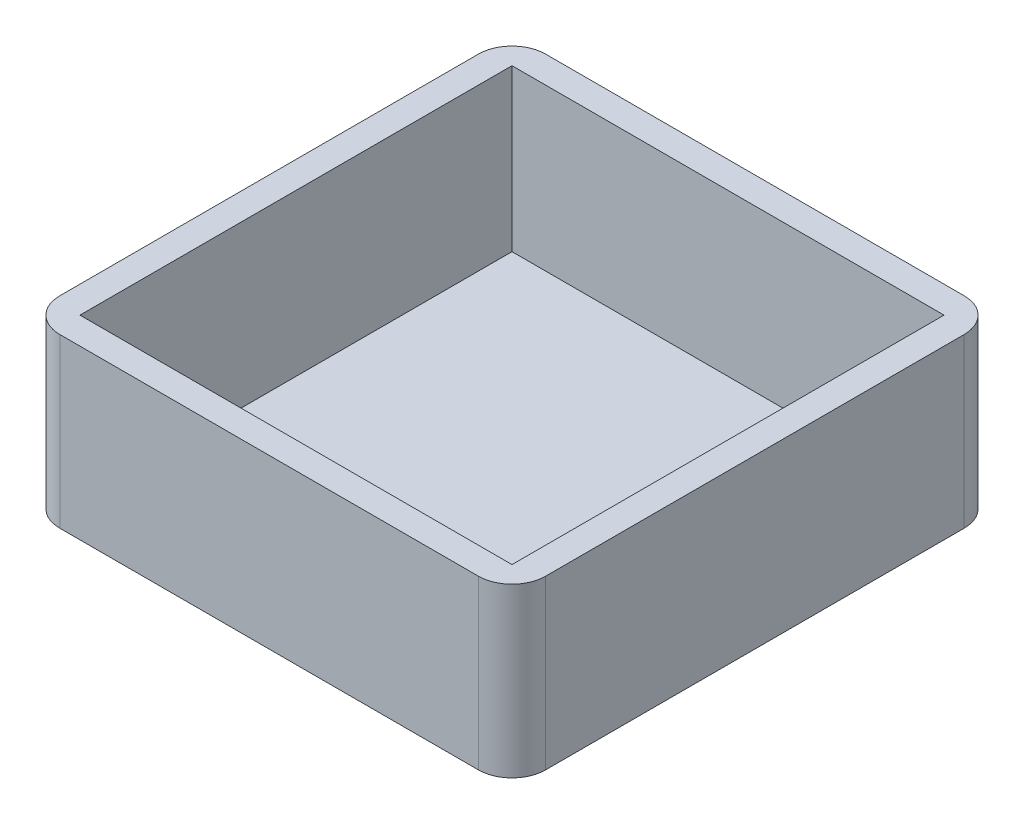
ISO-10303-21;
HEADER;
FILE_DESCRIPTION(('STEP AP214'),'2;1');
FILE_NAME('part.step','',(''),(''),'','','');
FILE_SCHEMA(('AUTOMOTIVE_DESIGN { 1 0 10303 214 1 1 1 1 }'));
ENDSEC;
DATA;
#1=APPLICATION_CONTEXT('core data for automotive mechanical design processes');
#2=APPLICATION_PROTOCOL_DEFINITION('international standard','automotive_design',2000,#1);
#3=PRODUCT_CONTEXT('',#1,'mechanical');
#4=PRODUCT('Part','Part','',(#3));
#5=PRODUCT_RELATED_PRODUCT_CATEGORY('part','',(#4));
#6=PRODUCT_DEFINITION_FORMATION('','',#4);
#7=PRODUCT_DEFINITION_CONTEXT('part definition',#1,'design');
#8=PRODUCT_DEFINITION('design','',#6,#7);
#9=PRODUCT_DEFINITION_SHAPE('','',#8);
#10=(LENGTH_UNIT() NAMED_UNIT(*) SI_UNIT(.MILLI.,.METRE.));
#11=(NAMED_UNIT(*) PLANE_ANGLE_UNIT() SI_UNIT($,.RADIAN.));
#12=(NAMED_UNIT(*) SI_UNIT($,.STERADIAN.) SOLID_ANGLE_UNIT());
#13=UNCERTAINTY_MEASURE_WITH_UNIT(LENGTH_MEASURE(1.E-05),#10,'distance_accuracy_value','');
#14=(GEOMETRIC_REPRESENTATION_CONTEXT(3) GLOBAL_UNCERTAINTY_ASSIGNED_CONTEXT((#13)) GLOBAL_UNIT_ASSIGNED_CONTEXT((#10,
#11,#12)) REPRESENTATION_CONTEXT('',''));
#15=CARTESIAN_POINT('',(0.,0.,0.));
#16=DIRECTION('',(0.,0.,1.));
#17=DIRECTION('',(1.,0.,0.));
#18=AXIS2_PLACEMENT_3D('',#15,#16,#17);
#19=CARTESIAN_POINT('',(72.3760070733407,50.,72.3760070733407));
#20=DIRECTION('',(-1.,0.,0.));
#21=DIRECTION('',(0.,0.,1.));
#22=AXIS2_PLACEMENT_3D('',#19,#20,#21);
#23=PLANE('',#22);
#24=DIRECTION('',(0.,0.,-1.));
#25=VECTOR('',#24,1.);
#26=CARTESIAN_POINT('',(72.3760070733407,0.,72.3760070733407));
#27=LINE('',#26,#25);
#28=CARTESIAN_POINT('',(72.3760070733407,0.,62.3760070733407));
#29=VERTEX_POINT('',#28);
#30=CARTESIAN_POINT('',(72.3760070733407,0.,-62.3760070733407));
#31=VERTEX_POINT('',#30);
#32=EDGE_CURVE('E167',#29,#31,#27,.T.);
#33=ORIENTED_EDGE('',*,*,#32,.T.);
#34=DIRECTION('',(0.,-1.,0.));
#35=VECTOR('',#34,1.);
#36=CARTESIAN_POINT('',(72.3760070733407,50.,-62.3760070733407));
#37=LINE('',#36,#35);
#38=CARTESIAN_POINT('',(72.3760070733407,50.,-62.3760070733407));
#39=VERTEX_POINT('',#38);
#40=EDGE_CURVE('E216',#31,#39,#37,.F.);
#41=ORIENTED_EDGE('',*,*,#40,.T.);
#42=DIRECTION('',(0.,0.,-1.));
#43=VECTOR('',#42,1.);
#44=CARTESIAN_POINT('',(72.3760070733407,50.,72.3760070733407));
#45=LINE('',#44,#43);
#46=CARTESIAN_POINT('',(72.3760070733407,50.,62.3760070733407));
#47=VERTEX_POINT('',#46);
#48=EDGE_CURVE('E168',#47,#39,#45,.T.);
#49=ORIENTED_EDGE('',*,*,#48,.F.);
#50=DIRECTION('',(0.,-1.,0.));
#51=VECTOR('',#50,1.);
#52=CARTESIAN_POINT('',(72.3760070733407,50.,62.3760070733407));
#53=LINE('',#52,#51);
#54=EDGE_CURVE('E213',#47,#29,#53,.T.);
#55=ORIENTED_EDGE('',*,*,#54,.T.);
#56=EDGE_LOOP('',(#33,#41,#49,#55));
#57=FACE_BOUND('',#56,.T.);
#58=ADVANCED_FACE('F39',(#57),#23,.F.);
#59=CARTESIAN_POINT('',(-72.3760070733407,50.,-72.3760070733407));
#60=DIRECTION('',(0.,0.,1.));
#61=DIRECTION('',(1.,0.,0.));
#62=AXIS2_PLACEMENT_3D('',#59,#60,#61);
#63=PLANE('',#62);
#64=DIRECTION('',(-1.,0.,0.));
#65=VECTOR('',#64,1.);
#66=CARTESIAN_POINT('',(-72.3760070733407,0.,-72.3760070733407));
#67=LINE('',#66,#65);
#68=CARTESIAN_POINT('',(62.3760070733407,0.,-72.3760070733407));
#69=VERTEX_POINT('',#68);
#70=CARTESIAN_POINT('',(-62.3760070733407,0.,-72.3760070733407));
#71=VERTEX_POINT('',#70);
#72=EDGE_CURVE('E182',#69,#71,#67,.T.);
#73=ORIENTED_EDGE('',*,*,#72,.T.);
#74=DIRECTION('',(0.,-1.,0.));
#75=VECTOR('',#74,1.);
#76=CARTESIAN_POINT('',(-62.3760070733407,50.,-72.3760070733407));
#77=LINE('',#76,#75);
#78=CARTESIAN_POINT('',(-62.3760070733407,50.,-72.3760070733407));
#79=VERTEX_POINT('',#78);
#80=EDGE_CURVE('E204',#71,#79,#77,.F.);
#81=ORIENTED_EDGE('',*,*,#80,.T.);
#82=DIRECTION('',(-1.,0.,0.));
#83=VECTOR('',#82,1.);
#84=CARTESIAN_POINT('',(-72.3760070733407,50.,-72.3760070733407));
#85=LINE('',#84,#83);
#86=CARTESIAN_POINT('',(62.3760070733407,50.,-72.3760070733407));
#87=VERTEX_POINT('',#86);
#88=EDGE_CURVE('E171',#87,#79,#85,.T.);
#89=ORIENTED_EDGE('',*,*,#88,.F.);
#90=DIRECTION('',(0.,-1.,0.));
#91=VECTOR('',#90,1.);
#92=CARTESIAN_POINT('',(62.3760070733407,50.,-72.3760070733407));
#93=LINE('',#92,#91);
#94=EDGE_CURVE('E201',#87,#69,#93,.T.);
#95=ORIENTED_EDGE('',*,*,#94,.T.);
#96=EDGE_LOOP('',(#73,#81,#89,#95));
#97=FACE_BOUND('',#96,.T.);
#98=ADVANCED_FACE('F241',(#97),#63,.F.);
#99=CARTESIAN_POINT('',(-72.3760070733407,50.,72.3760070733407));
#100=DIRECTION('',(1.,0.,0.));
#101=DIRECTION('',(0.,0.,-1.));
#102=AXIS2_PLACEMENT_3D('',#99,#100,#101);
#103=PLANE('',#102);
#104=DIRECTION('',(0.,0.,1.));
#105=VECTOR('',#104,1.);
#106=CARTESIAN_POINT('',(-72.3760070733407,50.,72.3760070733407));
#107=LINE('',#106,#105);
#108=CARTESIAN_POINT('',(-72.3760070733407,50.,-62.3760070733407));
#109=VERTEX_POINT('',#108);
#110=CARTESIAN_POINT('',(-72.3760070733407,50.,62.3760070733407));
#111=VERTEX_POINT('',#110);
#112=EDGE_CURVE('E175',#109,#111,#107,.T.);
#113=ORIENTED_EDGE('',*,*,#112,.F.);
#114=DIRECTION('',(0.,-1.,0.));
#115=VECTOR('',#114,1.);
#116=CARTESIAN_POINT('',(-72.3760070733407,50.,-62.3760070733407));
#117=LINE('',#116,#115);
#118=CARTESIAN_POINT('',(-72.3760070733407,0.,-62.3760070733407));
#119=VERTEX_POINT('',#118);
#120=EDGE_CURVE('E190',#109,#119,#117,.T.);
#121=ORIENTED_EDGE('',*,*,#120,.T.);
#122=DIRECTION('',(0.,0.,1.));
#123=VECTOR('',#122,1.);
#124=CARTESIAN_POINT('',(-72.3760070733407,0.,72.3760070733407));
#125=LINE('',#124,#123);
#126=CARTESIAN_POINT('',(-72.3760070733407,0.,62.3760070733407));
#127=VERTEX_POINT('',#126);
#128=EDGE_CURVE('E185',#119,#127,#125,.T.);
#129=ORIENTED_EDGE('',*,*,#128,.T.);
#130=DIRECTION('',(0.,-1.,0.));
#131=VECTOR('',#130,1.);
#132=CARTESIAN_POINT('',(-72.3760070733407,50.,62.3760070733407));
#133=LINE('',#132,#131);
#134=EDGE_CURVE('E179',#127,#111,#133,.F.);
#135=ORIENTED_EDGE('',*,*,#134,.T.);
#136=EDGE_LOOP('',(#113,#121,#129,#135));
#137=FACE_BOUND('',#136,.T.);
#138=ADVANCED_FACE('F249',(#137),#103,.F.);
#139=CARTESIAN_POINT('',(-72.3760070733407,50.,72.3760070733407));
#140=DIRECTION('',(0.,0.,-1.));
#141=DIRECTION('',(-1.,0.,0.));
#142=AXIS2_PLACEMENT_3D('',#139,#140,#141);
#143=PLANE('',#142);
#144=DIRECTION('',(1.,0.,0.));
#145=VECTOR('',#144,1.);
#146=CARTESIAN_POINT('',(-72.3760070733407,0.,72.3760070733407));
#147=LINE('',#146,#145);
#148=CARTESIAN_POINT('',(-62.3760070733407,0.,72.3760070733407));
#149=VERTEX_POINT('',#148);
#150=CARTESIAN_POINT('',(62.3760070733407,0.,72.3760070733407));
#151=VERTEX_POINT('',#150);
#152=EDGE_CURVE('E172',#149,#151,#147,.T.);
#153=ORIENTED_EDGE('',*,*,#152,.T.);
#154=DIRECTION('',(0.,-1.,0.));
#155=VECTOR('',#154,1.);
#156=CARTESIAN_POINT('',(62.3760070733407,50.,72.3760070733407));
#157=LINE('',#156,#155);
#158=CARTESIAN_POINT('',(62.3760070733407,50.,72.3760070733407));
#159=VERTEX_POINT('',#158);
#160=EDGE_CURVE('E12',#151,#159,#157,.F.);
#161=ORIENTED_EDGE('',*,*,#160,.T.);
#162=DIRECTION('',(1.,0.,0.));
#163=VECTOR('',#162,1.);
#164=CARTESIAN_POINT('',(-72.3760070733407,50.,72.3760070733407));
#165=LINE('',#164,#163);
#166=CARTESIAN_POINT('',(-62.3760070733407,50.,72.3760070733407));
#167=VERTEX_POINT('',#166);
#168=EDGE_CURVE('E177',#167,#159,#165,.T.);
#169=ORIENTED_EDGE('',*,*,#168,.F.);
#170=DIRECTION('',(0.,-1.,0.));
#171=VECTOR('',#170,1.);
#172=CARTESIAN_POINT('',(-62.3760070733407,50.,72.3760070733407));
#173=LINE('',#172,#171);
#174=EDGE_CURVE('E47',#167,#149,#173,.T.);
#175=ORIENTED_EDGE('',*,*,#174,.T.);
#176=EDGE_LOOP('',(#153,#161,#169,#175));
#177=FACE_BOUND('',#176,.T.);
#178=ADVANCED_FACE('F220',(#177),#143,.F.);
#179=CARTESIAN_POINT('',(0.,50.,0.));
#180=DIRECTION('',(0.,-1.,0.));
#181=DIRECTION('',(0.,0.,-1.));
#182=AXIS2_PLACEMENT_3D('',#179,#180,#181);
#183=PLANE('',#182);
#184=DIRECTION('',(0.,0.,1.));
#185=VECTOR('',#184,1.);
#186=CARTESIAN_POINT('',(-64.3760070733407,50.,64.3760070733407));
#187=LINE('',#186,#185);
#188=CARTESIAN_POINT('',(-64.3760070733407,50.,-64.3760070733407));
#189=VERTEX_POINT('',#188);
#190=CARTESIAN_POINT('',(-64.3760070733407,50.,64.3760070733407));
#191=VERTEX_POINT('',#190);
#192=EDGE_CURVE('E152',#189,#191,#187,.T.);
#193=ORIENTED_EDGE('',*,*,#192,.F.);
#194=DIRECTION('',(-1.,0.,0.));
#195=VECTOR('',#194,1.);
#196=CARTESIAN_POINT('',(-64.3760070733407,50.,-64.3760070733407));
#197=LINE('',#196,#195);
#198=CARTESIAN_POINT('',(64.3760070733407,50.,-64.3760070733407));
#199=VERTEX_POINT('',#198);
#200=EDGE_CURVE('E144',#199,#189,#197,.T.);
#201=ORIENTED_EDGE('',*,*,#200,.F.);
#202=DIRECTION('',(0.,0.,-1.));
#203=VECTOR('',#202,1.);
#204=CARTESIAN_POINT('',(64.3760070733407,50.,64.3760070733407));
#205=LINE('',#204,#203);
#206=CARTESIAN_POINT('',(64.3760070733407,50.,64.3760070733407));
#207=VERTEX_POINT('',#206);
#208=EDGE_CURVE('E156',#207,#199,#205,.T.);
#209=ORIENTED_EDGE('',*,*,#208,.F.);
#210=DIRECTION('',(1.,0.,0.));
#211=VECTOR('',#210,1.);
#212=CARTESIAN_POINT('',(-64.3760070733407,50.,64.3760070733407));
#213=LINE('',#212,#211);
#214=EDGE_CURVE('E150',#191,#207,#213,.T.);
#215=ORIENTED_EDGE('',*,*,#214,.F.);
#216=EDGE_LOOP('',(#193,#201,#209,#215));
#217=FACE_BOUND('',#216,.T.);
#218=ORIENTED_EDGE('',*,*,#88,.T.);
#219=CARTESIAN_POINT('',(-62.3760070733407,50.,-62.3760070733407));
#220=DIRECTION('',(0.,-1.,0.));
#221=DIRECTION('',(0.,0.,-1.));
#222=AXIS2_PLACEMENT_3D('',#219,#220,#221);
#223=CIRCLE('',#222,10.);
#224=EDGE_CURVE('E211',#79,#109,#223,.F.);
#225=ORIENTED_EDGE('',*,*,#224,.T.);
#226=ORIENTED_EDGE('',*,*,#112,.T.);
#227=CARTESIAN_POINT('',(-62.3760070733407,50.,62.3760070733407));
#228=DIRECTION('',(0.,-1.,0.));
#229=DIRECTION('',(0.,0.,-1.));
#230=AXIS2_PLACEMENT_3D('',#227,#228,#229);
#231=CIRCLE('',#230,10.);
#232=EDGE_CURVE('E59',#111,#167,#231,.F.);
#233=ORIENTED_EDGE('',*,*,#232,.T.);
#234=ORIENTED_EDGE('',*,*,#168,.T.);
#235=CARTESIAN_POINT('',(62.3760070733407,50.,62.3760070733407));
#236=DIRECTION('',(0.,-1.,0.));
#237=DIRECTION('',(0.,0.,-1.));
#238=AXIS2_PLACEMENT_3D('',#235,#236,#237);
#239=CIRCLE('',#238,10.);
#240=EDGE_CURVE('E207',#159,#47,#239,.F.);
#241=ORIENTED_EDGE('',*,*,#240,.T.);
#242=ORIENTED_EDGE('',*,*,#48,.T.);
#243=CARTESIAN_POINT('',(62.3760070733407,50.,-62.3760070733407));
#244=DIRECTION('',(0.,-1.,0.));
#245=DIRECTION('',(0.,0.,-1.));
#246=AXIS2_PLACEMENT_3D('',#243,#244,#245);
#247=CIRCLE('',#246,10.);
#248=EDGE_CURVE('E209',#39,#87,#247,.F.);
#249=ORIENTED_EDGE('',*,*,#248,.T.);
#250=EDGE_LOOP('',(#218,#225,#226,#233,#234,#241,#242,#249));
#251=FACE_BOUND('',#250,.T.);
#252=ADVANCED_FACE('F234',(#217,#251),#183,.F.);
#253=CARTESIAN_POINT('',(0.,0.,0.));
#254=DIRECTION('',(0.,-1.,0.));
#255=DIRECTION('',(0.,0.,-1.));
#256=AXIS2_PLACEMENT_3D('',#253,#254,#255);
#257=PLANE('',#256);
#258=ORIENTED_EDGE('',*,*,#128,.F.);
#259=CARTESIAN_POINT('',(-62.3760070733407,0.,-62.3760070733407));
#260=DIRECTION('',(0.,-1.,0.));
#261=DIRECTION('',(0.,0.,-1.));
#262=AXIS2_PLACEMENT_3D('',#259,#260,#261);
#263=CIRCLE('',#262,10.);
#264=EDGE_CURVE('E199',#119,#71,#263,.T.);
#265=ORIENTED_EDGE('',*,*,#264,.T.);
#266=ORIENTED_EDGE('',*,*,#72,.F.);
#267=CARTESIAN_POINT('',(62.3760070733407,0.,-62.3760070733407));
#268=DIRECTION('',(0.,-1.,0.));
#269=DIRECTION('',(0.,0.,-1.));
#270=AXIS2_PLACEMENT_3D('',#267,#268,#269);
#271=CIRCLE('',#270,10.);
#272=EDGE_CURVE('E197',#69,#31,#271,.T.);
#273=ORIENTED_EDGE('',*,*,#272,.T.);
#274=ORIENTED_EDGE('',*,*,#32,.F.);
#275=CARTESIAN_POINT('',(62.3760070733407,0.,62.3760070733407));
#276=DIRECTION('',(0.,-1.,0.));
#277=DIRECTION('',(0.,0.,-1.));
#278=AXIS2_PLACEMENT_3D('',#275,#276,#277);
#279=CIRCLE('',#278,10.);
#280=EDGE_CURVE('E195',#29,#151,#279,.T.);
#281=ORIENTED_EDGE('',*,*,#280,.T.);
#282=ORIENTED_EDGE('',*,*,#152,.F.);
#283=CARTESIAN_POINT('',(-62.3760070733407,0.,62.3760070733407));
#284=DIRECTION('',(0.,-1.,0.));
#285=DIRECTION('',(0.,0.,-1.));
#286=AXIS2_PLACEMENT_3D('',#283,#284,#285);
#287=CIRCLE('',#286,10.);
#288=EDGE_CURVE('E193',#149,#127,#287,.T.);
#289=ORIENTED_EDGE('',*,*,#288,.T.);
#290=EDGE_LOOP('',(#258,#265,#266,#273,#274,#281,#282,#289));
#291=FACE_BOUND('',#290,.T.);
#292=ADVANCED_FACE('F224',(#291),#257,.T.);
#293=CARTESIAN_POINT('',(0.,2.,0.));
#294=DIRECTION('',(0.,-1.,0.));
#295=DIRECTION('',(0.,0.,-1.));
#296=AXIS2_PLACEMENT_3D('',#293,#294,#295);
#297=PLANE('',#296);
#298=DIRECTION('',(0.,0.,-1.));
#299=VECTOR('',#298,1.);
#300=CARTESIAN_POINT('',(64.3760070733407,2.,64.3760070733407));
#301=LINE('',#300,#299);
#302=CARTESIAN_POINT('',(64.3760070733407,2.,64.3760070733407));
#303=VERTEX_POINT('',#302);
#304=CARTESIAN_POINT('',(64.3760070733407,2.,-64.3760070733407));
#305=VERTEX_POINT('',#304);
#306=EDGE_CURVE('E148',#303,#305,#301,.T.);
#307=ORIENTED_EDGE('',*,*,#306,.T.);
#308=DIRECTION('',(-1.,0.,0.));
#309=VECTOR('',#308,1.);
#310=CARTESIAN_POINT('',(-64.3760070733407,2.,-64.3760070733407));
#311=LINE('',#310,#309);
#312=CARTESIAN_POINT('',(-64.3760070733407,2.,-64.3760070733407));
#313=VERTEX_POINT('',#312);
#314=EDGE_CURVE('E141',#305,#313,#311,.T.);
#315=ORIENTED_EDGE('',*,*,#314,.T.);
#316=DIRECTION('',(0.,0.,1.));
#317=VECTOR('',#316,1.);
#318=CARTESIAN_POINT('',(-64.3760070733407,2.,64.3760070733407));
#319=LINE('',#318,#317);
#320=CARTESIAN_POINT('',(-64.3760070733407,2.,64.3760070733407));
#321=VERTEX_POINT('',#320);
#322=EDGE_CURVE('E128',#313,#321,#319,.T.);
#323=ORIENTED_EDGE('',*,*,#322,.T.);
#324=DIRECTION('',(1.,0.,0.));
#325=VECTOR('',#324,1.);
#326=CARTESIAN_POINT('',(-64.3760070733407,2.,64.3760070733407));
#327=LINE('',#326,#325);
#328=EDGE_CURVE('E161',#321,#303,#327,.T.);
#329=ORIENTED_EDGE('',*,*,#328,.T.);
#330=EDGE_LOOP('',(#307,#315,#323,#329));
#331=FACE_BOUND('',#330,.T.);
#332=ADVANCED_FACE('F147',(#331),#297,.F.);
#333=CARTESIAN_POINT('',(-64.3760070733407,-182.082844589089,-64.3760070733407));
#334=DIRECTION('',(0.,0.,-1.));
#335=DIRECTION('',(-1.,0.,0.));
#336=AXIS2_PLACEMENT_3D('',#333,#334,#335);
#337=PLANE('',#336);
#338=DIRECTION('',(0.,1.,0.));
#339=VECTOR('',#338,1.);
#340=CARTESIAN_POINT('',(64.3760070733407,-182.082844589089,-64.3760070733407));
#341=LINE('',#340,#339);
#342=EDGE_CURVE('E159',#305,#199,#341,.T.);
#343=ORIENTED_EDGE('',*,*,#342,.T.);
#344=ORIENTED_EDGE('',*,*,#200,.T.);
#345=DIRECTION('',(0.,1.,0.));
#346=VECTOR('',#345,1.);
#347=CARTESIAN_POINT('',(-64.3760070733407,-182.082844589089,-64.3760070733407));
#348=LINE('',#347,#346);
#349=EDGE_CURVE('E132',#313,#189,#348,.T.);
#350=ORIENTED_EDGE('',*,*,#349,.F.);
#351=ORIENTED_EDGE('',*,*,#314,.F.);
#352=EDGE_LOOP('',(#343,#344,#350,#351));
#353=FACE_BOUND('',#352,.T.);
#354=ADVANCED_FACE('F140',(#353),#337,.F.);
#355=CARTESIAN_POINT('',(-64.3760070733407,-182.082844589089,64.3760070733407));
#356=DIRECTION('',(-1.,0.,0.));
#357=DIRECTION('',(0.,0.,1.));
#358=AXIS2_PLACEMENT_3D('',#355,#356,#357);
#359=PLANE('',#358);
#360=ORIENTED_EDGE('',*,*,#349,.T.);
#361=ORIENTED_EDGE('',*,*,#192,.T.);
#362=DIRECTION('',(0.,1.,0.));
#363=VECTOR('',#362,1.);
#364=CARTESIAN_POINT('',(-64.3760070733407,-182.082844589089,64.3760070733407));
#365=LINE('',#364,#363);
#366=EDGE_CURVE('E134',#321,#191,#365,.T.);
#367=ORIENTED_EDGE('',*,*,#366,.F.);
#368=ORIENTED_EDGE('',*,*,#322,.F.);
#369=EDGE_LOOP('',(#360,#361,#367,#368));
#370=FACE_BOUND('',#369,.T.);
#371=ADVANCED_FACE('F130',(#370),#359,.F.);
#372=CARTESIAN_POINT('',(-64.3760070733407,-182.082844589089,64.3760070733407));
#373=DIRECTION('',(0.,0.,1.));
#374=DIRECTION('',(1.,0.,0.));
#375=AXIS2_PLACEMENT_3D('',#372,#373,#374);
#376=PLANE('',#375);
#377=ORIENTED_EDGE('',*,*,#366,.T.);
#378=ORIENTED_EDGE('',*,*,#214,.T.);
#379=DIRECTION('',(0.,1.,0.));
#380=VECTOR('',#379,1.);
#381=CARTESIAN_POINT('',(64.3760070733407,-182.082844589089,64.3760070733407));
#382=LINE('',#381,#380);
#383=EDGE_CURVE('E160',#303,#207,#382,.T.);
#384=ORIENTED_EDGE('',*,*,#383,.F.);
#385=ORIENTED_EDGE('',*,*,#328,.F.);
#386=EDGE_LOOP('',(#377,#378,#384,#385));
#387=FACE_BOUND('',#386,.T.);
#388=ADVANCED_FACE('F302',(#387),#376,.F.);
#389=CARTESIAN_POINT('',(64.3760070733407,-182.082844589089,64.3760070733407));
#390=DIRECTION('',(1.,0.,0.));
#391=DIRECTION('',(0.,0.,-1.));
#392=AXIS2_PLACEMENT_3D('',#389,#390,#391);
#393=PLANE('',#392);
#394=ORIENTED_EDGE('',*,*,#383,.T.);
#395=ORIENTED_EDGE('',*,*,#208,.T.);
#396=ORIENTED_EDGE('',*,*,#342,.F.);
#397=ORIENTED_EDGE('',*,*,#306,.F.);
#398=EDGE_LOOP('',(#394,#395,#396,#397));
#399=FACE_BOUND('',#398,.T.);
#400=ADVANCED_FACE('F266',(#399),#393,.F.);
#401=CARTESIAN_POINT('',(-62.3760070733407,50.,-62.3760070733407));
#402=DIRECTION('',(0.,-1.,0.));
#403=DIRECTION('',(0.,0.,-1.));
#404=AXIS2_PLACEMENT_3D('',#401,#402,#403);
#405=CYLINDRICAL_SURFACE('',#404,10.);
#406=ORIENTED_EDGE('',*,*,#224,.F.);
#407=ORIENTED_EDGE('',*,*,#80,.F.);
#408=ORIENTED_EDGE('',*,*,#264,.F.);
#409=ORIENTED_EDGE('',*,*,#120,.F.);
#410=EDGE_LOOP('',(#406,#407,#408,#409));
#411=FACE_BOUND('',#410,.T.);
#412=ADVANCED_FACE('F246',(#411),#405,.T.);
#413=CARTESIAN_POINT('',(62.3760070733407,50.,-62.3760070733407));
#414=DIRECTION('',(0.,-1.,0.));
#415=DIRECTION('',(0.,0.,-1.));
#416=AXIS2_PLACEMENT_3D('',#413,#414,#415);
#417=CYLINDRICAL_SURFACE('',#416,10.);
#418=ORIENTED_EDGE('',*,*,#248,.F.);
#419=ORIENTED_EDGE('',*,*,#40,.F.);
#420=ORIENTED_EDGE('',*,*,#272,.F.);
#421=ORIENTED_EDGE('',*,*,#94,.F.);
#422=EDGE_LOOP('',(#418,#419,#420,#421));
#423=FACE_BOUND('',#422,.T.);
#424=ADVANCED_FACE('F238',(#423),#417,.T.);
#425=CARTESIAN_POINT('',(62.3760070733407,50.,62.3760070733407));
#426=DIRECTION('',(0.,-1.,0.));
#427=DIRECTION('',(0.,0.,-1.));
#428=AXIS2_PLACEMENT_3D('',#425,#426,#427);
#429=CYLINDRICAL_SURFACE('',#428,10.);
#430=ORIENTED_EDGE('',*,*,#240,.F.);
#431=ORIENTED_EDGE('',*,*,#160,.F.);
#432=ORIENTED_EDGE('',*,*,#280,.F.);
#433=ORIENTED_EDGE('',*,*,#54,.F.);
#434=EDGE_LOOP('',(#430,#431,#432,#433));
#435=FACE_BOUND('',#434,.T.);
#436=ADVANCED_FACE('F229',(#435),#429,.T.);
#437=CARTESIAN_POINT('',(-62.3760070733407,50.,62.3760070733407));
#438=DIRECTION('',(0.,-1.,0.));
#439=DIRECTION('',(0.,0.,-1.));
#440=AXIS2_PLACEMENT_3D('',#437,#438,#439);
#441=CYLINDRICAL_SURFACE('',#440,10.);
#442=ORIENTED_EDGE('',*,*,#232,.F.);
#443=ORIENTED_EDGE('',*,*,#134,.F.);
#444=ORIENTED_EDGE('',*,*,#288,.F.);
#445=ORIENTED_EDGE('',*,*,#174,.F.);
#446=EDGE_LOOP('',(#442,#443,#444,#445));
#447=FACE_BOUND('',#446,.T.);
#448=ADVANCED_FACE('F41',(#447),#441,.T.);
#449=CLOSED_SHELL('',(#58,#98,#138,#178,#252,#292,#332,#354,#371,#388,#400,#412,#424,#436,#448));
#450=MANIFOLD_SOLID_BREP('B2',#449);
#451=ADVANCED_BREP_SHAPE_REPRESENTATION('',(#18,#450),#14);
#452=SHAPE_DEFINITION_REPRESENTATION(#9,#451);
ENDSEC;
END-ISO-10303-21;
